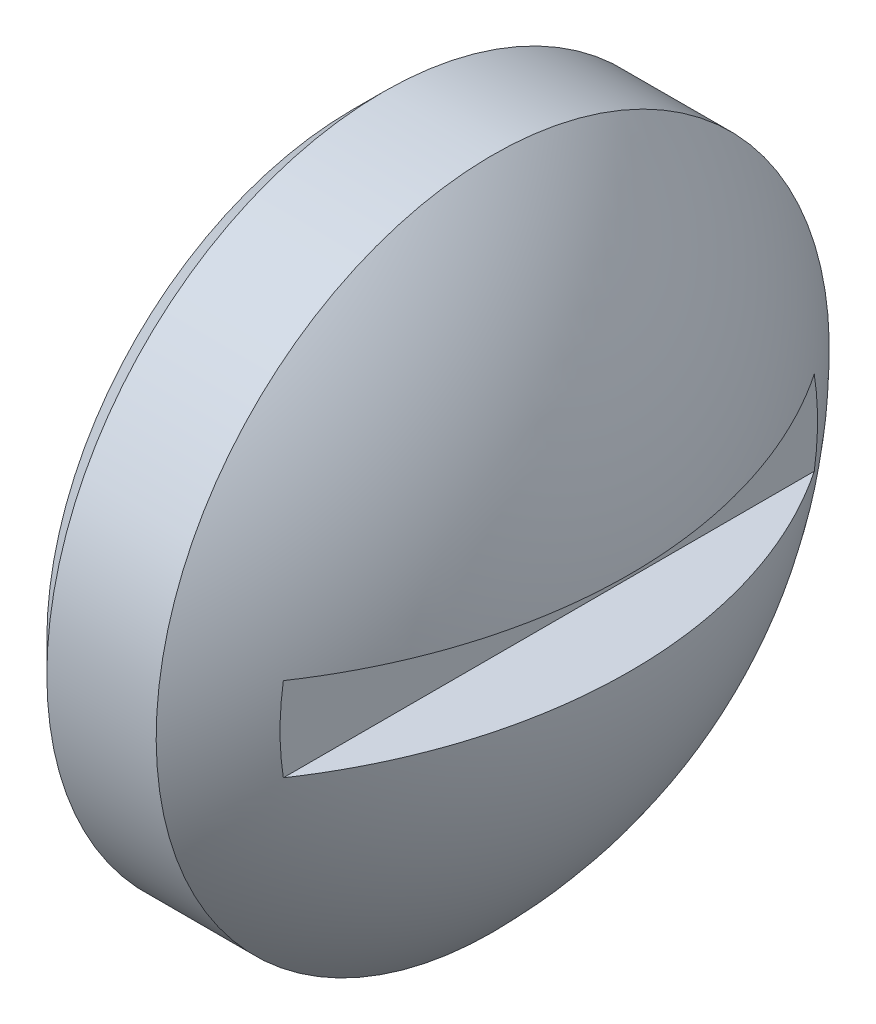
ISO-10303-21;
HEADER;
FILE_DESCRIPTION(('STEP AP214'),'2;1');
FILE_NAME('part.step','',(''),(''),'','','');
FILE_SCHEMA(('AUTOMOTIVE_DESIGN { 1 0 10303 214 1 1 1 1 }'));
ENDSEC;
DATA;
#1=APPLICATION_CONTEXT('core data for automotive mechanical design processes');
#2=APPLICATION_PROTOCOL_DEFINITION('international standard','automotive_design',2000,#1);
#3=PRODUCT_CONTEXT('',#1,'mechanical');
#4=PRODUCT('Part','Part','',(#3));
#5=PRODUCT_RELATED_PRODUCT_CATEGORY('part','',(#4));
#6=PRODUCT_DEFINITION_FORMATION('','',#4);
#7=PRODUCT_DEFINITION_CONTEXT('part definition',#1,'design');
#8=PRODUCT_DEFINITION('design','',#6,#7);
#9=PRODUCT_DEFINITION_SHAPE('','',#8);
#10=(LENGTH_UNIT() NAMED_UNIT(*) SI_UNIT(.MILLI.,.METRE.));
#11=(NAMED_UNIT(*) PLANE_ANGLE_UNIT() SI_UNIT($,.RADIAN.));
#12=(NAMED_UNIT(*) SI_UNIT($,.STERADIAN.) SOLID_ANGLE_UNIT());
#13=UNCERTAINTY_MEASURE_WITH_UNIT(LENGTH_MEASURE(1.E-05),#10,'distance_accuracy_value','');
#14=(GEOMETRIC_REPRESENTATION_CONTEXT(3) GLOBAL_UNCERTAINTY_ASSIGNED_CONTEXT((#13)) GLOBAL_UNIT_ASSIGNED_CONTEXT((#10,
#11,#12)) REPRESENTATION_CONTEXT('',''));
#15=CARTESIAN_POINT('',(0.,0.,0.));
#16=DIRECTION('',(0.,0.,1.));
#17=DIRECTION('',(1.,0.,0.));
#18=AXIS2_PLACEMENT_3D('',#15,#16,#17);
#19=CARTESIAN_POINT('',(-7.0415945787923,0.,0.));
#20=DIRECTION('',(-1.,0.,0.));
#21=DIRECTION('',(0.,1.,0.));
#22=AXIS2_PLACEMENT_3D('',#19,#20,#21);
#23=SPHERICAL_SURFACE('',#22,17.);
#24=CARTESIAN_POINT('',(5.,0.,0.));
#25=DIRECTION('',(-1.,0.,0.));
#26=DIRECTION('',(0.,-1.,0.));
#27=AXIS2_PLACEMENT_3D('',#24,#25,#26);
#28=CIRCLE('',#27,12.);
#29=CARTESIAN_POINT('',(5.00000000000001,-12.,0.));
#30=VERTEX_POINT('',#29);
#31=EDGE_CURVE('E85',#30,#30,#28,.T.);
#32=ORIENTED_EDGE('',*,*,#31,.F.);
#33=EDGE_LOOP('',(#32));
#34=FACE_BOUND('',#33,.T.);
#35=CARTESIAN_POINT('',(-7.0415945787923,1.49999999999999,0.));
#36=DIRECTION('',(0.,-1.,0.));
#37=DIRECTION('',(1.,0.,0.));
#38=AXIS2_PLACEMENT_3D('',#35,#36,#37);
#39=CIRCLE('',#38,16.9336942218761);
#40=CARTESIAN_POINT('',(7.,1.5,-9.46486247574839));
#41=VERTEX_POINT('',#40);
#42=CARTESIAN_POINT('',(7.,1.5,9.46486247574848));
#43=VERTEX_POINT('',#42);
#44=EDGE_CURVE('E58',#41,#43,#39,.T.);
#45=ORIENTED_EDGE('',*,*,#44,.F.);
#46=CARTESIAN_POINT('',(7.,0.,0.));
#47=DIRECTION('',(-1.,0.,0.));
#48=DIRECTION('',(0.,0.,1.));
#49=AXIS2_PLACEMENT_3D('',#46,#47,#48);
#50=CIRCLE('',#49,9.58298605262633);
#51=CARTESIAN_POINT('',(7.,-1.5,-9.46486247574844));
#52=VERTEX_POINT('',#51);
#53=EDGE_CURVE('E67',#41,#52,#50,.T.);
#54=ORIENTED_EDGE('',*,*,#53,.T.);
#55=CARTESIAN_POINT('',(-7.0415945787923,-1.5,0.));
#56=DIRECTION('',(0.,1.,0.));
#57=DIRECTION('',(-1.,0.,0.));
#58=AXIS2_PLACEMENT_3D('',#55,#56,#57);
#59=CIRCLE('',#58,16.9336942218761);
#60=CARTESIAN_POINT('',(7.,-1.5,9.46486247574844));
#61=VERTEX_POINT('',#60);
#62=EDGE_CURVE('E65',#61,#52,#59,.T.);
#63=ORIENTED_EDGE('',*,*,#62,.F.);
#64=EDGE_CURVE('E66',#61,#43,#50,.T.);
#65=ORIENTED_EDGE('',*,*,#64,.T.);
#66=EDGE_LOOP('',(#45,#54,#63,#65));
#67=FACE_BOUND('',#66,.T.);
#68=ADVANCED_FACE('F36',(#34,#67),#23,.T.);
#69=CARTESIAN_POINT('',(0.,7.5,0.));
#70=DIRECTION('',(1.,0.,0.));
#71=DIRECTION('',(0.,1.,0.));
#72=AXIS2_PLACEMENT_3D('',#69,#70,#71);
#73=PLANE('',#72);
#74=CARTESIAN_POINT('',(0.,0.,0.));
#75=DIRECTION('',(1.,0.,0.));
#76=DIRECTION('',(0.,1.,0.));
#77=AXIS2_PLACEMENT_3D('',#74,#75,#76);
#78=CIRCLE('',#77,10.8985);
#79=CARTESIAN_POINT('',(0.,10.8985,0.));
#80=VERTEX_POINT('',#79);
#81=EDGE_CURVE('E44',#80,#80,#78,.F.);
#82=ORIENTED_EDGE('',*,*,#81,.T.);
#83=EDGE_LOOP('',(#82));
#84=FACE_BOUND('',#83,.T.);
#85=CARTESIAN_POINT('',(0.,0.,0.));
#86=DIRECTION('',(-1.,0.,0.));
#87=DIRECTION('',(0.,-1.,0.));
#88=AXIS2_PLACEMENT_3D('',#85,#86,#87);
#89=CIRCLE('',#88,7.5);
#90=CARTESIAN_POINT('',(0.,-7.5,0.));
#91=VERTEX_POINT('',#90);
#92=EDGE_CURVE('E79',#91,#91,#89,.T.);
#93=ORIENTED_EDGE('',*,*,#92,.F.);
#94=EDGE_LOOP('',(#93));
#95=FACE_BOUND('',#94,.T.);
#96=ADVANCED_FACE('F90',(#84,#95),#73,.F.);
#97=CARTESIAN_POINT('',(0.,0.,0.));
#98=DIRECTION('',(-1.,0.,0.));
#99=DIRECTION('',(0.,-1.,0.));
#100=AXIS2_PLACEMENT_3D('',#97,#98,#99);
#101=CYLINDRICAL_SURFACE('',#100,12.);
#102=CARTESIAN_POINT('',(1.10150000000001,0.,0.));
#103=DIRECTION('',(1.,0.,0.));
#104=DIRECTION('',(0.,1.,0.));
#105=AXIS2_PLACEMENT_3D('',#102,#103,#104);
#106=CIRCLE('',#105,12.);
#107=CARTESIAN_POINT('',(1.10150000000001,12.,0.));
#108=VERTEX_POINT('',#107);
#109=EDGE_CURVE('E11',#108,#108,#106,.T.);
#110=ORIENTED_EDGE('',*,*,#109,.T.);
#111=EDGE_LOOP('',(#110));
#112=FACE_BOUND('',#111,.T.);
#113=ORIENTED_EDGE('',*,*,#31,.T.);
#114=EDGE_LOOP('',(#113));
#115=FACE_BOUND('',#114,.T.);
#116=ADVANCED_FACE('F113',(#112,#115),#101,.T.);
#117=CARTESIAN_POINT('',(3.5,7.5,0.));
#118=DIRECTION('',(1.,0.,0.));
#119=DIRECTION('',(0.,1.,0.));
#120=AXIS2_PLACEMENT_3D('',#117,#118,#119);
#121=PLANE('',#120);
#122=CARTESIAN_POINT('',(3.5,0.,0.));
#123=DIRECTION('',(-1.,0.,0.));
#124=DIRECTION('',(0.,-1.,0.));
#125=AXIS2_PLACEMENT_3D('',#122,#123,#124);
#126=CIRCLE('',#125,7.5);
#127=CARTESIAN_POINT('',(3.5,-7.5,0.));
#128=VERTEX_POINT('',#127);
#129=EDGE_CURVE('E82',#128,#128,#126,.T.);
#130=ORIENTED_EDGE('',*,*,#129,.T.);
#131=EDGE_LOOP('',(#130));
#132=FACE_BOUND('',#131,.T.);
#133=ADVANCED_FACE('F103',(#132),#121,.F.);
#134=CARTESIAN_POINT('',(0.,0.,0.));
#135=DIRECTION('',(-1.,0.,0.));
#136=DIRECTION('',(0.,-1.,0.));
#137=AXIS2_PLACEMENT_3D('',#134,#135,#136);
#138=CYLINDRICAL_SURFACE('',#137,7.5);
#139=ORIENTED_EDGE('',*,*,#129,.F.);
#140=EDGE_LOOP('',(#139));
#141=FACE_BOUND('',#140,.T.);
#142=ORIENTED_EDGE('',*,*,#92,.T.);
#143=EDGE_LOOP('',(#142));
#144=FACE_BOUND('',#143,.T.);
#145=ADVANCED_FACE('F95',(#141,#144),#138,.F.);
#146=CARTESIAN_POINT('',(0.,0.,0.));
#147=DIRECTION('',(1.,0.,0.));
#148=DIRECTION('',(0.,1.,0.));
#149=AXIS2_PLACEMENT_3D('',#146,#147,#148);
#150=CONICAL_SURFACE('',#149,10.8985,0.785398163397445);
#151=ORIENTED_EDGE('',*,*,#109,.F.);
#152=EDGE_LOOP('',(#151));
#153=FACE_BOUND('',#152,.T.);
#154=ORIENTED_EDGE('',*,*,#81,.F.);
#155=EDGE_LOOP('',(#154));
#156=FACE_BOUND('',#155,.T.);
#157=ADVANCED_FACE('F38',(#153,#156),#150,.T.);
#158=CARTESIAN_POINT('',(9.89209964308381,1.49999999999999,25.));
#159=DIRECTION('',(0.,-1.,0.));
#160=DIRECTION('',(1.,0.,0.));
#161=AXIS2_PLACEMENT_3D('',#158,#159,#160);
#162=PLANE('',#161);
#163=ORIENTED_EDGE('',*,*,#44,.T.);
#164=DIRECTION('',(0.,0.,1.));
#165=VECTOR('',#164,1.);
#166=CARTESIAN_POINT('',(7.,1.5,25.));
#167=LINE('',#166,#165);
#168=EDGE_CURVE('E51',#41,#43,#167,.T.);
#169=ORIENTED_EDGE('',*,*,#168,.F.);
#170=EDGE_LOOP('',(#163,#169));
#171=FACE_BOUND('',#170,.T.);
#172=ADVANCED_FACE('F94',(#171),#162,.T.);
#173=CARTESIAN_POINT('',(9.89209964308381,-1.5,25.));
#174=DIRECTION('',(0.,1.,0.));
#175=DIRECTION('',(-1.,0.,0.));
#176=AXIS2_PLACEMENT_3D('',#173,#174,#175);
#177=PLANE('',#176);
#178=DIRECTION('',(0.,0.,-1.));
#179=VECTOR('',#178,1.);
#180=CARTESIAN_POINT('',(7.,-1.5,25.));
#181=LINE('',#180,#179);
#182=EDGE_CURVE('E70',#61,#52,#181,.T.);
#183=ORIENTED_EDGE('',*,*,#182,.F.);
#184=ORIENTED_EDGE('',*,*,#62,.T.);
#185=EDGE_LOOP('',(#183,#184));
#186=FACE_BOUND('',#185,.T.);
#187=ADVANCED_FACE('F74',(#186),#177,.T.);
#188=CARTESIAN_POINT('',(7.,0.,0.));
#189=DIRECTION('',(-1.,0.,0.));
#190=DIRECTION('',(0.,-1.,0.));
#191=AXIS2_PLACEMENT_3D('',#188,#189,#190);
#192=PLANE('',#191);
#193=ORIENTED_EDGE('',*,*,#182,.T.);
#194=ORIENTED_EDGE('',*,*,#53,.F.);
#195=ORIENTED_EDGE('',*,*,#168,.T.);
#196=ORIENTED_EDGE('',*,*,#64,.F.);
#197=EDGE_LOOP('',(#193,#194,#195,#196));
#198=FACE_BOUND('',#197,.T.);
#199=ADVANCED_FACE('F72',(#198),#192,.F.);
#200=CLOSED_SHELL('',(#68,#96,#116,#133,#145,#157,#172,#187,#199));
#201=MANIFOLD_SOLID_BREP('B2',#200);
#202=ADVANCED_BREP_SHAPE_REPRESENTATION('',(#18,#201),#14);
#203=SHAPE_DEFINITION_REPRESENTATION(#9,#202);
ENDSEC;
END-ISO-10303-21;
